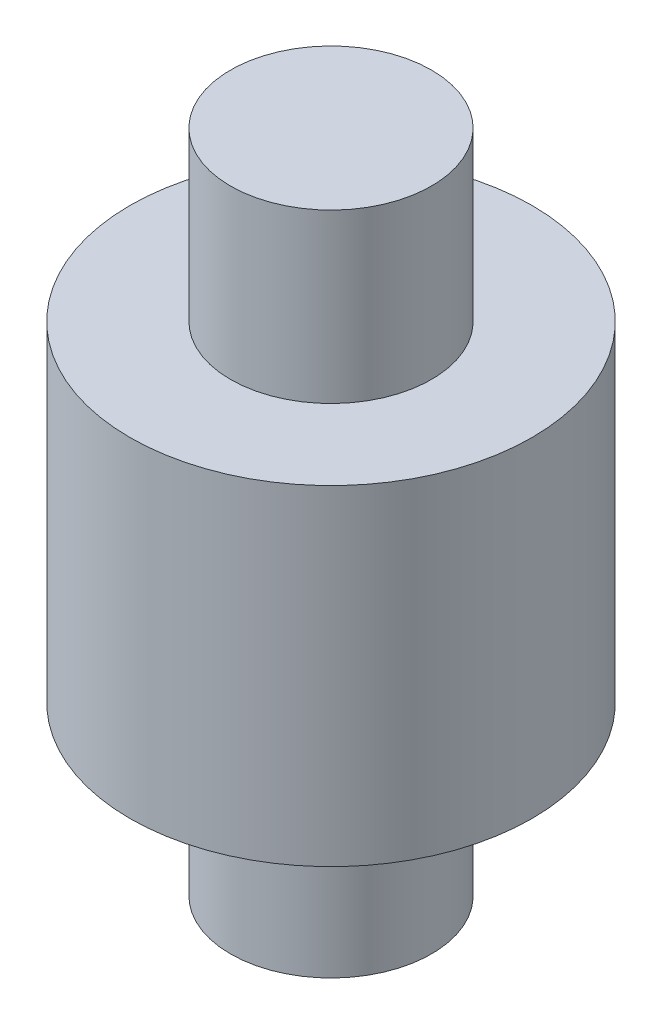
ISO-10303-21;
HEADER;
FILE_DESCRIPTION(('STEP AP214'),'2;1');
FILE_NAME('part.step','',(''),(''),'','','');
FILE_SCHEMA(('AUTOMOTIVE_DESIGN { 1 0 10303 214 1 1 1 1 }'));
ENDSEC;
DATA;
#1=APPLICATION_CONTEXT('core data for automotive mechanical design processes');
#2=APPLICATION_PROTOCOL_DEFINITION('international standard','automotive_design',2000,#1);
#3=PRODUCT_CONTEXT('',#1,'mechanical');
#4=PRODUCT('Part','Part','',(#3));
#5=PRODUCT_RELATED_PRODUCT_CATEGORY('part','',(#4));
#6=PRODUCT_DEFINITION_FORMATION('','',#4);
#7=PRODUCT_DEFINITION_CONTEXT('part definition',#1,'design');
#8=PRODUCT_DEFINITION('design','',#6,#7);
#9=PRODUCT_DEFINITION_SHAPE('','',#8);
#10=(LENGTH_UNIT() NAMED_UNIT(*) SI_UNIT(.MILLI.,.METRE.));
#11=(NAMED_UNIT(*) PLANE_ANGLE_UNIT() SI_UNIT($,.RADIAN.));
#12=(NAMED_UNIT(*) SI_UNIT($,.STERADIAN.) SOLID_ANGLE_UNIT());
#13=UNCERTAINTY_MEASURE_WITH_UNIT(LENGTH_MEASURE(1.E-05),#10,'distance_accuracy_value','');
#14=(GEOMETRIC_REPRESENTATION_CONTEXT(3) GLOBAL_UNCERTAINTY_ASSIGNED_CONTEXT((#13)) GLOBAL_UNIT_ASSIGNED_CONTEXT((#10,
#11,#12)) REPRESENTATION_CONTEXT('',''));
#15=CARTESIAN_POINT('',(0.,0.,0.));
#16=DIRECTION('',(0.,0.,1.));
#17=DIRECTION('',(1.,0.,0.));
#18=AXIS2_PLACEMENT_3D('',#15,#16,#17);
#19=CARTESIAN_POINT('',(0.,0.,0.));
#20=DIRECTION('',(0.,1.,0.));
#21=DIRECTION('',(0.,0.,1.));
#22=AXIS2_PLACEMENT_3D('',#19,#20,#21);
#23=CYLINDRICAL_SURFACE('',#22,1.524);
#24=CARTESIAN_POINT('',(0.,0.,0.));
#25=DIRECTION('',(0.,1.,0.));
#26=DIRECTION('',(0.,0.,1.));
#27=AXIS2_PLACEMENT_3D('',#24,#25,#26);
#28=CIRCLE('',#27,1.524);
#29=CARTESIAN_POINT('',(0.,0.,1.524));
#30=VERTEX_POINT('',#29);
#31=EDGE_CURVE('E10',#30,#30,#28,.T.);
#32=ORIENTED_EDGE('',*,*,#31,.T.);
#33=EDGE_LOOP('',(#32));
#34=FACE_BOUND('',#33,.T.);
#35=CARTESIAN_POINT('',(0.,2.54,0.));
#36=DIRECTION('',(0.,1.,0.));
#37=DIRECTION('',(0.,0.,1.));
#38=AXIS2_PLACEMENT_3D('',#35,#36,#37);
#39=CIRCLE('',#38,1.524);
#40=CARTESIAN_POINT('',(0.,2.54,1.524));
#41=VERTEX_POINT('',#40);
#42=EDGE_CURVE('E54',#41,#41,#39,.T.);
#43=ORIENTED_EDGE('',*,*,#42,.F.);
#44=EDGE_LOOP('',(#43));
#45=FACE_BOUND('',#44,.T.);
#46=ADVANCED_FACE('F32',(#34,#45),#23,.T.);
#47=CARTESIAN_POINT('',(1.524,0.,0.));
#48=DIRECTION('',(0.,-1.,0.));
#49=DIRECTION('',(0.,0.,-1.));
#50=AXIS2_PLACEMENT_3D('',#47,#48,#49);
#51=PLANE('',#50);
#52=ORIENTED_EDGE('',*,*,#31,.F.);
#53=EDGE_LOOP('',(#52));
#54=FACE_BOUND('',#53,.T.);
#55=ADVANCED_FACE('F62',(#54),#51,.T.);
#56=CARTESIAN_POINT('',(0.,10.0838,0.));
#57=DIRECTION('',(0.,1.,0.));
#58=DIRECTION('',(0.,0.,1.));
#59=AXIS2_PLACEMENT_3D('',#56,#57,#58);
#60=PLANE('',#59);
#61=CARTESIAN_POINT('',(0.,10.0838,0.));
#62=DIRECTION('',(0.,1.,0.));
#63=DIRECTION('',(0.,0.,1.));
#64=AXIS2_PLACEMENT_3D('',#61,#62,#63);
#65=CIRCLE('',#64,1.524);
#66=CARTESIAN_POINT('',(0.,10.0838,1.524));
#67=VERTEX_POINT('',#66);
#68=EDGE_CURVE('E38',#67,#67,#65,.T.);
#69=ORIENTED_EDGE('',*,*,#68,.T.);
#70=EDGE_LOOP('',(#69));
#71=FACE_BOUND('',#70,.T.);
#72=ADVANCED_FACE('F66',(#71),#60,.T.);
#73=CARTESIAN_POINT('',(0.,0.,0.));
#74=DIRECTION('',(0.,1.,0.));
#75=DIRECTION('',(0.,0.,1.));
#76=AXIS2_PLACEMENT_3D('',#73,#74,#75);
#77=CYLINDRICAL_SURFACE('',#76,1.524);
#78=CARTESIAN_POINT('',(0.,7.5438,0.));
#79=DIRECTION('',(0.,1.,0.));
#80=DIRECTION('',(0.,0.,1.));
#81=AXIS2_PLACEMENT_3D('',#78,#79,#80);
#82=CIRCLE('',#81,1.524);
#83=CARTESIAN_POINT('',(0.,7.5438,1.524));
#84=VERTEX_POINT('',#83);
#85=EDGE_CURVE('E42',#84,#84,#82,.T.);
#86=ORIENTED_EDGE('',*,*,#85,.T.);
#87=EDGE_LOOP('',(#86));
#88=FACE_BOUND('',#87,.T.);
#89=ORIENTED_EDGE('',*,*,#68,.F.);
#90=EDGE_LOOP('',(#89));
#91=FACE_BOUND('',#90,.T.);
#92=ADVANCED_FACE('F71',(#88,#91),#77,.T.);
#93=CARTESIAN_POINT('',(1.524,7.5438,0.));
#94=DIRECTION('',(0.,1.,0.));
#95=DIRECTION('',(0.,0.,1.));
#96=AXIS2_PLACEMENT_3D('',#93,#94,#95);
#97=PLANE('',#96);
#98=CARTESIAN_POINT('',(0.,7.5438,0.));
#99=DIRECTION('',(0.,1.,0.));
#100=DIRECTION('',(0.,0.,1.));
#101=AXIS2_PLACEMENT_3D('',#98,#99,#100);
#102=CIRCLE('',#101,3.048);
#103=CARTESIAN_POINT('',(0.,7.5438,3.048));
#104=VERTEX_POINT('',#103);
#105=EDGE_CURVE('E46',#104,#104,#102,.T.);
#106=ORIENTED_EDGE('',*,*,#105,.T.);
#107=EDGE_LOOP('',(#106));
#108=FACE_BOUND('',#107,.T.);
#109=ORIENTED_EDGE('',*,*,#85,.F.);
#110=EDGE_LOOP('',(#109));
#111=FACE_BOUND('',#110,.T.);
#112=ADVANCED_FACE('F76',(#108,#111),#97,.T.);
#113=CARTESIAN_POINT('',(0.,0.,0.));
#114=DIRECTION('',(0.,1.,0.));
#115=DIRECTION('',(0.,0.,1.));
#116=AXIS2_PLACEMENT_3D('',#113,#114,#115);
#117=CYLINDRICAL_SURFACE('',#116,3.048);
#118=CARTESIAN_POINT('',(0.,2.54,0.));
#119=DIRECTION('',(0.,1.,0.));
#120=DIRECTION('',(0.,0.,1.));
#121=AXIS2_PLACEMENT_3D('',#118,#119,#120);
#122=CIRCLE('',#121,3.048);
#123=CARTESIAN_POINT('',(0.,2.54,3.048));
#124=VERTEX_POINT('',#123);
#125=EDGE_CURVE('E51',#124,#124,#122,.T.);
#126=ORIENTED_EDGE('',*,*,#125,.T.);
#127=EDGE_LOOP('',(#126));
#128=FACE_BOUND('',#127,.T.);
#129=ORIENTED_EDGE('',*,*,#105,.F.);
#130=EDGE_LOOP('',(#129));
#131=FACE_BOUND('',#130,.T.);
#132=ADVANCED_FACE('F80',(#128,#131),#117,.T.);
#133=CARTESIAN_POINT('',(3.048,2.54,0.));
#134=DIRECTION('',(0.,-1.,0.));
#135=DIRECTION('',(0.,0.,-1.));
#136=AXIS2_PLACEMENT_3D('',#133,#134,#135);
#137=PLANE('',#136);
#138=ORIENTED_EDGE('',*,*,#42,.T.);
#139=EDGE_LOOP('',(#138));
#140=FACE_BOUND('',#139,.T.);
#141=ORIENTED_EDGE('',*,*,#125,.F.);
#142=EDGE_LOOP('',(#141));
#143=FACE_BOUND('',#142,.T.);
#144=ADVANCED_FACE('F58',(#140,#143),#137,.T.);
#145=CLOSED_SHELL('',(#46,#55,#72,#92,#112,#132,#144));
#146=MANIFOLD_SOLID_BREP('B2',#145);
#147=ADVANCED_BREP_SHAPE_REPRESENTATION('',(#18,#146),#14);
#148=SHAPE_DEFINITION_REPRESENTATION(#9,#147);
ENDSEC;
END-ISO-10303-21;
